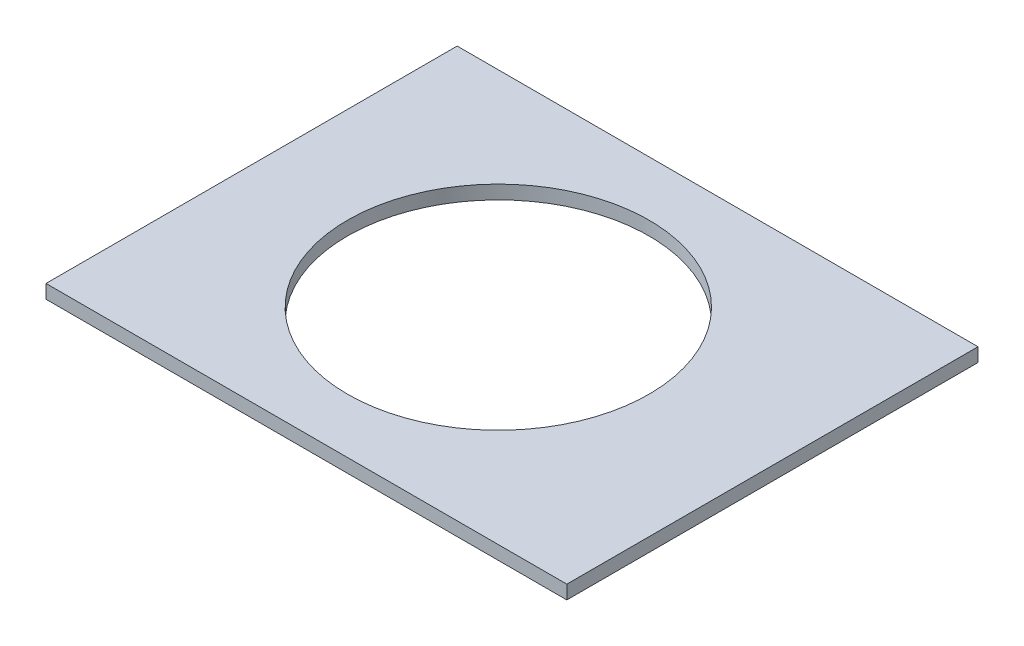
ISO-10303-21;
HEADER;
FILE_DESCRIPTION(('STEP AP214'),'2;1');
FILE_NAME('part.step','',(''),(''),'','','');
FILE_SCHEMA(('AUTOMOTIVE_DESIGN { 1 0 10303 214 1 1 1 1 }'));
ENDSEC;
DATA;
#1=APPLICATION_CONTEXT('core data for automotive mechanical design processes');
#2=APPLICATION_PROTOCOL_DEFINITION('international standard','automotive_design',2000,#1);
#3=PRODUCT_CONTEXT('',#1,'mechanical');
#4=PRODUCT('Part','Part','',(#3));
#5=PRODUCT_RELATED_PRODUCT_CATEGORY('part','',(#4));
#6=PRODUCT_DEFINITION_FORMATION('','',#4);
#7=PRODUCT_DEFINITION_CONTEXT('part definition',#1,'design');
#8=PRODUCT_DEFINITION('design','',#6,#7);
#9=PRODUCT_DEFINITION_SHAPE('','',#8);
#10=(LENGTH_UNIT() NAMED_UNIT(*) SI_UNIT(.MILLI.,.METRE.));
#11=(NAMED_UNIT(*) PLANE_ANGLE_UNIT() SI_UNIT($,.RADIAN.));
#12=(NAMED_UNIT(*) SI_UNIT($,.STERADIAN.) SOLID_ANGLE_UNIT());
#13=UNCERTAINTY_MEASURE_WITH_UNIT(LENGTH_MEASURE(1.E-05),#10,'distance_accuracy_value','');
#14=(GEOMETRIC_REPRESENTATION_CONTEXT(3) GLOBAL_UNCERTAINTY_ASSIGNED_CONTEXT((#13)) GLOBAL_UNIT_ASSIGNED_CONTEXT((#10,
#11,#12)) REPRESENTATION_CONTEXT('',''));
#15=CARTESIAN_POINT('',(0.,0.,0.));
#16=DIRECTION('',(0.,0.,1.));
#17=DIRECTION('',(1.,0.,0.));
#18=AXIS2_PLACEMENT_3D('',#15,#16,#17);
#19=CARTESIAN_POINT('',(-19.,9.,15.));
#20=DIRECTION('',(1.,0.,0.));
#21=DIRECTION('',(0.,0.,-1.));
#22=AXIS2_PLACEMENT_3D('',#19,#20,#21);
#23=PLANE('',#22);
#24=DIRECTION('',(0.,0.,1.));
#25=VECTOR('',#24,1.);
#26=CARTESIAN_POINT('',(-19.,8.,15.));
#27=LINE('',#26,#25);
#28=CARTESIAN_POINT('',(-19.,8.,-15.));
#29=VERTEX_POINT('',#28);
#30=CARTESIAN_POINT('',(-19.,8.,15.));
#31=VERTEX_POINT('',#30);
#32=EDGE_CURVE('E96',#29,#31,#27,.T.);
#33=ORIENTED_EDGE('',*,*,#32,.T.);
#34=DIRECTION('',(0.,-1.,0.));
#35=VECTOR('',#34,1.);
#36=CARTESIAN_POINT('',(-19.,9.,15.));
#37=LINE('',#36,#35);
#38=CARTESIAN_POINT('',(-19.,9.,15.));
#39=VERTEX_POINT('',#38);
#40=EDGE_CURVE('E11',#39,#31,#37,.T.);
#41=ORIENTED_EDGE('',*,*,#40,.F.);
#42=DIRECTION('',(0.,0.,1.));
#43=VECTOR('',#42,1.);
#44=CARTESIAN_POINT('',(-19.,9.,15.));
#45=LINE('',#44,#43);
#46=CARTESIAN_POINT('',(-19.,9.,-15.));
#47=VERTEX_POINT('',#46);
#48=EDGE_CURVE('E84',#47,#39,#45,.T.);
#49=ORIENTED_EDGE('',*,*,#48,.F.);
#50=DIRECTION('',(0.,-1.,0.));
#51=VECTOR('',#50,1.);
#52=CARTESIAN_POINT('',(-19.,9.,-15.));
#53=LINE('',#52,#51);
#54=EDGE_CURVE('E92',#47,#29,#53,.T.);
#55=ORIENTED_EDGE('',*,*,#54,.T.);
#56=EDGE_LOOP('',(#33,#41,#49,#55));
#57=FACE_BOUND('',#56,.T.);
#58=ADVANCED_FACE('F33',(#57),#23,.F.);
#59=CARTESIAN_POINT('',(19.,9.,15.));
#60=DIRECTION('',(0.,0.,-1.));
#61=DIRECTION('',(-1.,0.,0.));
#62=AXIS2_PLACEMENT_3D('',#59,#60,#61);
#63=PLANE('',#62);
#64=DIRECTION('',(1.,0.,0.));
#65=VECTOR('',#64,1.);
#66=CARTESIAN_POINT('',(19.,8.,15.));
#67=LINE('',#66,#65);
#68=CARTESIAN_POINT('',(19.,8.,15.));
#69=VERTEX_POINT('',#68);
#70=EDGE_CURVE('E88',#31,#69,#67,.T.);
#71=ORIENTED_EDGE('',*,*,#70,.T.);
#72=DIRECTION('',(0.,-1.,0.));
#73=VECTOR('',#72,1.);
#74=CARTESIAN_POINT('',(19.,9.,15.));
#75=LINE('',#74,#73);
#76=CARTESIAN_POINT('',(19.,9.,15.));
#77=VERTEX_POINT('',#76);
#78=EDGE_CURVE('E41',#77,#69,#75,.T.);
#79=ORIENTED_EDGE('',*,*,#78,.F.);
#80=DIRECTION('',(1.,0.,0.));
#81=VECTOR('',#80,1.);
#82=CARTESIAN_POINT('',(19.,9.,15.));
#83=LINE('',#82,#81);
#84=EDGE_CURVE('E79',#39,#77,#83,.T.);
#85=ORIENTED_EDGE('',*,*,#84,.F.);
#86=ORIENTED_EDGE('',*,*,#40,.T.);
#87=EDGE_LOOP('',(#71,#79,#85,#86));
#88=FACE_BOUND('',#87,.T.);
#89=ADVANCED_FACE('F87',(#88),#63,.F.);
#90=CARTESIAN_POINT('',(19.,9.,15.));
#91=DIRECTION('',(-1.,0.,0.));
#92=DIRECTION('',(0.,0.,1.));
#93=AXIS2_PLACEMENT_3D('',#90,#91,#92);
#94=PLANE('',#93);
#95=DIRECTION('',(0.,0.,-1.));
#96=VECTOR('',#95,1.);
#97=CARTESIAN_POINT('',(19.,8.,15.));
#98=LINE('',#97,#96);
#99=CARTESIAN_POINT('',(19.,8.,-15.));
#100=VERTEX_POINT('',#99);
#101=EDGE_CURVE('E66',#69,#100,#98,.T.);
#102=ORIENTED_EDGE('',*,*,#101,.T.);
#103=DIRECTION('',(0.,-1.,0.));
#104=VECTOR('',#103,1.);
#105=CARTESIAN_POINT('',(19.,9.,-15.));
#106=LINE('',#105,#104);
#107=CARTESIAN_POINT('',(19.,9.,-15.));
#108=VERTEX_POINT('',#107);
#109=EDGE_CURVE('E89',#108,#100,#106,.T.);
#110=ORIENTED_EDGE('',*,*,#109,.F.);
#111=DIRECTION('',(0.,0.,-1.));
#112=VECTOR('',#111,1.);
#113=CARTESIAN_POINT('',(19.,9.,15.));
#114=LINE('',#113,#112);
#115=EDGE_CURVE('E82',#77,#108,#114,.T.);
#116=ORIENTED_EDGE('',*,*,#115,.F.);
#117=ORIENTED_EDGE('',*,*,#78,.T.);
#118=EDGE_LOOP('',(#102,#110,#116,#117));
#119=FACE_BOUND('',#118,.T.);
#120=ADVANCED_FACE('F90',(#119),#94,.F.);
#121=CARTESIAN_POINT('',(19.,9.,-15.));
#122=DIRECTION('',(0.,0.,1.));
#123=DIRECTION('',(1.,0.,0.));
#124=AXIS2_PLACEMENT_3D('',#121,#122,#123);
#125=PLANE('',#124);
#126=DIRECTION('',(-1.,0.,0.));
#127=VECTOR('',#126,1.);
#128=CARTESIAN_POINT('',(19.,8.,-15.));
#129=LINE('',#128,#127);
#130=EDGE_CURVE('E72',#100,#29,#129,.T.);
#131=ORIENTED_EDGE('',*,*,#130,.T.);
#132=ORIENTED_EDGE('',*,*,#54,.F.);
#133=DIRECTION('',(-1.,0.,0.));
#134=VECTOR('',#133,1.);
#135=CARTESIAN_POINT('',(19.,9.,-15.));
#136=LINE('',#135,#134);
#137=EDGE_CURVE('E49',#108,#47,#136,.T.);
#138=ORIENTED_EDGE('',*,*,#137,.F.);
#139=ORIENTED_EDGE('',*,*,#109,.T.);
#140=EDGE_LOOP('',(#131,#132,#138,#139));
#141=FACE_BOUND('',#140,.T.);
#142=ADVANCED_FACE('F104',(#141),#125,.F.);
#143=CARTESIAN_POINT('',(0.,9.,0.));
#144=DIRECTION('',(0.,1.,0.));
#145=DIRECTION('',(0.,0.,1.));
#146=AXIS2_PLACEMENT_3D('',#143,#144,#145);
#147=PLANE('',#146);
#148=CARTESIAN_POINT('',(-1.,9.,0.));
#149=DIRECTION('',(0.,1.,0.));
#150=DIRECTION('',(0.,0.,1.));
#151=AXIS2_PLACEMENT_3D('',#148,#149,#150);
#152=CIRCLE('',#151,11.);
#153=CARTESIAN_POINT('',(-1.,9.,11.));
#154=VERTEX_POINT('',#153);
#155=EDGE_CURVE('E110',#154,#154,#152,.T.);
#156=ORIENTED_EDGE('',*,*,#155,.F.);
#157=EDGE_LOOP('',(#156));
#158=FACE_BOUND('',#157,.T.);
#159=ORIENTED_EDGE('',*,*,#48,.T.);
#160=ORIENTED_EDGE('',*,*,#84,.T.);
#161=ORIENTED_EDGE('',*,*,#115,.T.);
#162=ORIENTED_EDGE('',*,*,#137,.T.);
#163=EDGE_LOOP('',(#159,#160,#161,#162));
#164=FACE_BOUND('',#163,.T.);
#165=ADVANCED_FACE('F80',(#158,#164),#147,.T.);
#166=CARTESIAN_POINT('',(0.,8.,0.));
#167=DIRECTION('',(0.,1.,0.));
#168=DIRECTION('',(0.,0.,1.));
#169=AXIS2_PLACEMENT_3D('',#166,#167,#168);
#170=PLANE('',#169);
#171=CARTESIAN_POINT('',(-1.,8.,0.));
#172=DIRECTION('',(0.,1.,0.));
#173=DIRECTION('',(0.,0.,1.));
#174=AXIS2_PLACEMENT_3D('',#171,#172,#173);
#175=CIRCLE('',#174,11.);
#176=CARTESIAN_POINT('',(-1.,8.,11.));
#177=VERTEX_POINT('',#176);
#178=EDGE_CURVE('E99',#177,#177,#175,.T.);
#179=ORIENTED_EDGE('',*,*,#178,.T.);
#180=EDGE_LOOP('',(#179));
#181=FACE_BOUND('',#180,.T.);
#182=ORIENTED_EDGE('',*,*,#32,.F.);
#183=ORIENTED_EDGE('',*,*,#130,.F.);
#184=ORIENTED_EDGE('',*,*,#101,.F.);
#185=ORIENTED_EDGE('',*,*,#70,.F.);
#186=EDGE_LOOP('',(#182,#183,#184,#185));
#187=FACE_BOUND('',#186,.T.);
#188=ADVANCED_FACE('F107',(#181,#187),#170,.F.);
#189=CARTESIAN_POINT('',(-1.,8.,0.));
#190=DIRECTION('',(0.,1.,0.));
#191=DIRECTION('',(0.,0.,1.));
#192=AXIS2_PLACEMENT_3D('',#189,#190,#191);
#193=CYLINDRICAL_SURFACE('',#192,11.);
#194=ORIENTED_EDGE('',*,*,#178,.F.);
#195=EDGE_LOOP('',(#194));
#196=FACE_BOUND('',#195,.T.);
#197=ORIENTED_EDGE('',*,*,#155,.T.);
#198=EDGE_LOOP('',(#197));
#199=FACE_BOUND('',#198,.T.);
#200=ADVANCED_FACE('F117',(#196,#199),#193,.F.);
#201=CLOSED_SHELL('',(#58,#89,#120,#142,#165,#188,#200));
#202=MANIFOLD_SOLID_BREP('B2',#201);
#203=ADVANCED_BREP_SHAPE_REPRESENTATION('',(#18,#202),#14);
#204=SHAPE_DEFINITION_REPRESENTATION(#9,#203);
ENDSEC;
END-ISO-10303-21;
